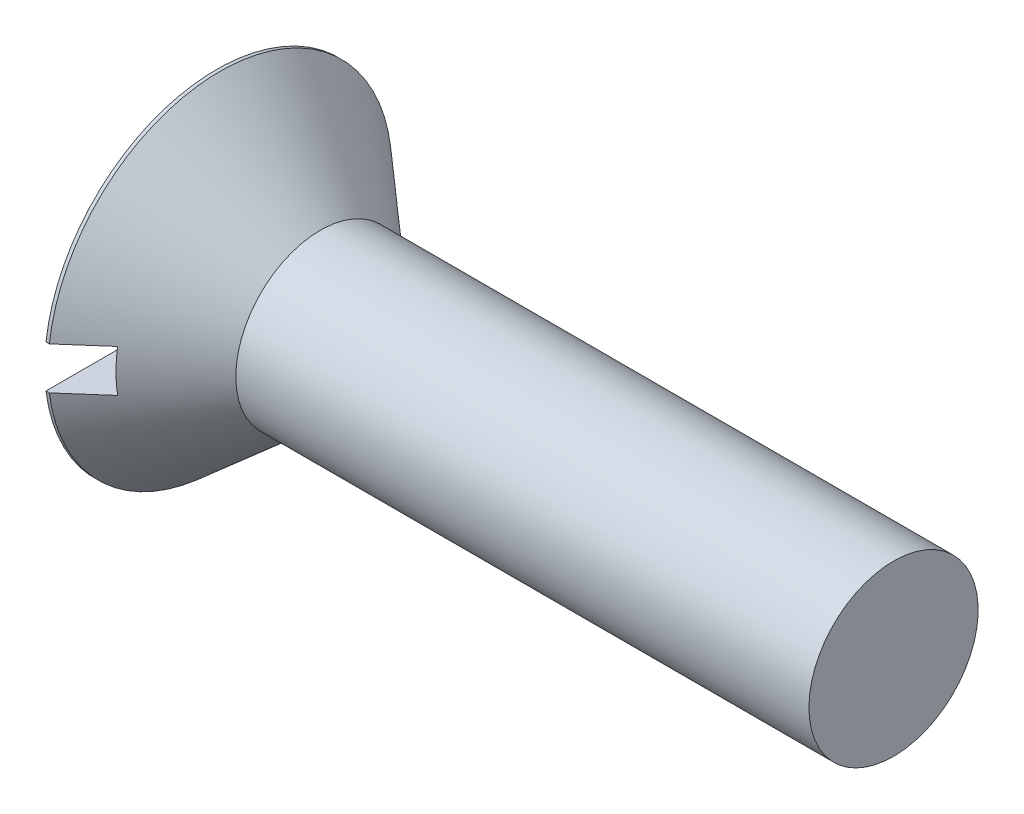
ISO-10303-21;
HEADER;
FILE_DESCRIPTION(('STEP AP214'),'2;1');
FILE_NAME('part.step','',(''),(''),'','','');
FILE_SCHEMA(('AUTOMOTIVE_DESIGN { 1 0 10303 214 1 1 1 1 }'));
ENDSEC;
DATA;
#1=APPLICATION_CONTEXT('core data for automotive mechanical design processes');
#2=APPLICATION_PROTOCOL_DEFINITION('international standard','automotive_design',2000,#1);
#3=PRODUCT_CONTEXT('',#1,'mechanical');
#4=PRODUCT('Part','Part','',(#3));
#5=PRODUCT_RELATED_PRODUCT_CATEGORY('part','',(#4));
#6=PRODUCT_DEFINITION_FORMATION('','',#4);
#7=PRODUCT_DEFINITION_CONTEXT('part definition',#1,'design');
#8=PRODUCT_DEFINITION('design','',#6,#7);
#9=PRODUCT_DEFINITION_SHAPE('','',#8);
#10=(LENGTH_UNIT() NAMED_UNIT(*) SI_UNIT(.MILLI.,.METRE.));
#11=(NAMED_UNIT(*) PLANE_ANGLE_UNIT() SI_UNIT($,.RADIAN.));
#12=(NAMED_UNIT(*) SI_UNIT($,.STERADIAN.) SOLID_ANGLE_UNIT());
#13=UNCERTAINTY_MEASURE_WITH_UNIT(LENGTH_MEASURE(1.E-05),#10,'distance_accuracy_value','');
#14=(GEOMETRIC_REPRESENTATION_CONTEXT(3) GLOBAL_UNCERTAINTY_ASSIGNED_CONTEXT((#13)) GLOBAL_UNIT_ASSIGNED_CONTEXT((#10,
#11,#12)) REPRESENTATION_CONTEXT('',''));
#15=CARTESIAN_POINT('',(0.,0.,0.));
#16=DIRECTION('',(0.,0.,1.));
#17=DIRECTION('',(1.,0.,0.));
#18=AXIS2_PLACEMENT_3D('',#15,#16,#17);
#19=CARTESIAN_POINT('',(2.2352,1.1938,-9.67739999999999));
#20=DIRECTION('',(-1.,0.,0.));
#21=DIRECTION('',(0.,0.,1.));
#22=AXIS2_PLACEMENT_3D('',#19,#20,#21);
#23=PLANE('',#22);
#24=DIRECTION('',(0.,-1.,0.));
#25=VECTOR('',#24,1.);
#26=CARTESIAN_POINT('',(2.2352,1.19379999999995,4.93366687898089));
#27=LINE('',#26,#25);
#28=CARTESIAN_POINT('',(2.2352,0.93915286624202,4.93366687898089));
#29=VERTEX_POINT('',#28);
#30=CARTESIAN_POINT('',(2.2352,-0.939152866242055,4.93366687898089));
#31=VERTEX_POINT('',#30);
#32=EDGE_CURVE('E316',#29,#31,#27,.T.);
#33=ORIENTED_EDGE('',*,*,#32,.T.);
#34=DIRECTION('',(0.,0.,-1.));
#35=VECTOR('',#34,1.);
#36=CARTESIAN_POINT('',(2.2352,-0.939152866242006,-9.6774));
#37=LINE('',#36,#35);
#38=CARTESIAN_POINT('',(2.2352,-0.939152866242041,0.939152866242038));
#39=VERTEX_POINT('',#38);
#40=EDGE_CURVE('E163',#31,#39,#37,.T.);
#41=ORIENTED_EDGE('',*,*,#40,.T.);
#42=DIRECTION('',(0.,-1.,0.));
#43=VECTOR('',#42,1.);
#44=CARTESIAN_POINT('',(2.2352,1.1938,0.939152866242037));
#45=LINE('',#44,#43);
#46=CARTESIAN_POINT('',(2.2352,-1.1938,0.939152866242037));
#47=VERTEX_POINT('',#46);
#48=EDGE_CURVE('E40',#39,#47,#45,.T.);
#49=ORIENTED_EDGE('',*,*,#48,.T.);
#50=DIRECTION('',(0.,0.,1.));
#51=VECTOR('',#50,1.);
#52=CARTESIAN_POINT('',(2.2352,-1.1938,-9.6774));
#53=LINE('',#52,#51);
#54=CARTESIAN_POINT('',(2.2352,-1.1938,7.80709754166015));
#55=VERTEX_POINT('',#54);
#56=EDGE_CURVE('E55',#47,#55,#53,.T.);
#57=ORIENTED_EDGE('',*,*,#56,.T.);
#58=CARTESIAN_POINT('',(2.2352,0.,0.));
#59=DIRECTION('',(-1.,0.,0.));
#60=DIRECTION('',(0.,0.,1.));
#61=AXIS2_PLACEMENT_3D('',#58,#59,#60);
#62=CIRCLE('',#61,7.89784340595558);
#63=CARTESIAN_POINT('',(2.2352,1.1938,7.80709754166015));
#64=VERTEX_POINT('',#63);
#65=EDGE_CURVE('E264',#64,#55,#62,.F.);
#66=ORIENTED_EDGE('',*,*,#65,.F.);
#67=DIRECTION('',(0.,0.,-1.));
#68=VECTOR('',#67,1.);
#69=CARTESIAN_POINT('',(2.2352,1.1938,9.6774));
#70=LINE('',#69,#68);
#71=CARTESIAN_POINT('',(2.2352,1.1938,0.939152866242037));
#72=VERTEX_POINT('',#71);
#73=EDGE_CURVE('E228',#64,#72,#70,.T.);
#74=ORIENTED_EDGE('',*,*,#73,.T.);
#75=CARTESIAN_POINT('',(2.2352,0.939152866242034,0.939152866242037));
#76=VERTEX_POINT('',#75);
#77=EDGE_CURVE('E11',#72,#76,#45,.T.);
#78=ORIENTED_EDGE('',*,*,#77,.T.);
#79=DIRECTION('',(0.,0.,1.));
#80=VECTOR('',#79,1.);
#81=CARTESIAN_POINT('',(2.2352,0.939152866242072,-9.67739999999999));
#82=LINE('',#81,#80);
#83=EDGE_CURVE('E317',#76,#29,#82,.T.);
#84=ORIENTED_EDGE('',*,*,#83,.T.);
#85=EDGE_LOOP('',(#33,#41,#49,#57,#66,#74,#78,#84));
#86=FACE_BOUND('',#85,.T.);
#87=ADVANCED_FACE('F32',(#86),#23,.T.);
#88=DIRECTION('',(0.,1.,0.));
#89=VECTOR('',#88,1.);
#90=CARTESIAN_POINT('',(2.2352,1.1938,-0.939152866242039));
#91=LINE('',#90,#89);
#92=CARTESIAN_POINT('',(2.2352,-1.1938,-0.939152866242039));
#93=VERTEX_POINT('',#92);
#94=CARTESIAN_POINT('',(2.2352,-0.939152866242035,-0.939152866242038));
#95=VERTEX_POINT('',#94);
#96=EDGE_CURVE('E389',#93,#95,#91,.T.);
#97=ORIENTED_EDGE('',*,*,#96,.T.);
#98=DIRECTION('',(0.,0.,-1.));
#99=VECTOR('',#98,1.);
#100=CARTESIAN_POINT('',(2.2352,-0.939152866242006,-9.6774));
#101=LINE('',#100,#99);
#102=CARTESIAN_POINT('',(2.2352,-0.939152866242022,-4.9336668789809));
#103=VERTEX_POINT('',#102);
#104=EDGE_CURVE('E189',#95,#103,#101,.T.);
#105=ORIENTED_EDGE('',*,*,#104,.T.);
#106=DIRECTION('',(0.,1.,0.));
#107=VECTOR('',#106,1.);
#108=CARTESIAN_POINT('',(2.2352,1.19379999999998,-4.93366687898089));
#109=LINE('',#108,#107);
#110=CARTESIAN_POINT('',(2.2352,0.939152866242055,-4.93366687898089));
#111=VERTEX_POINT('',#110);
#112=EDGE_CURVE('E332',#103,#111,#109,.T.);
#113=ORIENTED_EDGE('',*,*,#112,.T.);
#114=DIRECTION('',(0.,0.,1.));
#115=VECTOR('',#114,1.);
#116=CARTESIAN_POINT('',(2.2352,0.939152866242072,-9.67739999999999));
#117=LINE('',#116,#115);
#118=CARTESIAN_POINT('',(2.2352,0.939152866242041,-0.939152866242038));
#119=VERTEX_POINT('',#118);
#120=EDGE_CURVE('E322',#111,#119,#117,.T.);
#121=ORIENTED_EDGE('',*,*,#120,.T.);
#122=CARTESIAN_POINT('',(2.2352,1.1938,-0.939152866242035));
#123=VERTEX_POINT('',#122);
#124=EDGE_CURVE('E47',#119,#123,#91,.T.);
#125=ORIENTED_EDGE('',*,*,#124,.T.);
#126=CARTESIAN_POINT('',(2.2352,1.1938,-7.80709754166015));
#127=VERTEX_POINT('',#126);
#128=EDGE_CURVE('E231',#123,#127,#70,.T.);
#129=ORIENTED_EDGE('',*,*,#128,.T.);
#130=CARTESIAN_POINT('',(2.2352,-1.1938,-7.80709754166015));
#131=VERTEX_POINT('',#130);
#132=EDGE_CURVE('E268',#131,#127,#62,.F.);
#133=ORIENTED_EDGE('',*,*,#132,.F.);
#134=EDGE_CURVE('E232',#131,#93,#53,.T.);
#135=ORIENTED_EDGE('',*,*,#134,.T.);
#136=EDGE_LOOP('',(#97,#105,#113,#121,#125,#129,#133,#135));
#137=FACE_BOUND('',#136,.T.);
#138=ADVANCED_FACE('F311',(#137),#23,.T.);
#139=CARTESIAN_POINT('',(8.69008083333333,0.,0.497178541666667));
#140=DIRECTION('',(-0.0683113918583954,0.,-0.997664048536565));
#141=DIRECTION('',(-0.997664048536565,0.,0.0683113918583954));
#142=AXIS2_PLACEMENT_3D('',#139,#140,#141);
#143=PLANE('',#142);
#144=ORIENTED_EDGE('',*,*,#48,.F.);
#145=DIRECTION('',(0.995344390972083,0.0681525618022289,-0.0681525618022287));
#146=VECTOR('',#145,1.);
#147=CARTESIAN_POINT('',(8.72380707400527,-0.494869260856328,0.494869260856327));
#148=LINE('',#147,#146);
#149=CARTESIAN_POINT('',(7.9756,-0.546100000000002,0.546099999999999));
#150=VERTEX_POINT('',#149);
#151=EDGE_CURVE('E161',#39,#150,#148,.T.);
#152=ORIENTED_EDGE('',*,*,#151,.T.);
#153=DIRECTION('',(0.793328420082592,0.606365671400707,-0.0543202580629801));
#154=VECTOR('',#153,1.);
#155=CARTESIAN_POINT('',(0.,-6.6421,1.0922));
#156=LINE('',#155,#154);
#157=CARTESIAN_POINT('',(0.,-6.6421,1.0922));
#158=VERTEX_POINT('',#157);
#159=EDGE_CURVE('E186',#158,#150,#156,.T.);
#160=ORIENTED_EDGE('',*,*,#159,.F.);
#161=DIRECTION('',(0.,-1.,0.));
#162=VECTOR('',#161,1.);
#163=CARTESIAN_POINT('',(0.,6.6421,1.0922));
#164=LINE('',#163,#162);
#165=CARTESIAN_POINT('',(0.,-1.1938,1.0922));
#166=VERTEX_POINT('',#165);
#167=EDGE_CURVE('E344',#166,#158,#164,.T.);
#168=ORIENTED_EDGE('',*,*,#167,.F.);
#169=DIRECTION('',(0.997664048536565,0.,-0.0683113918583954));
#170=VECTOR('',#169,1.);
#171=CARTESIAN_POINT('',(2.95873739744039,-1.1938,0.889611292850418));
#172=LINE('',#171,#170);
#173=EDGE_CURVE('E223',#166,#47,#172,.T.);
#174=ORIENTED_EDGE('',*,*,#173,.T.);
#175=EDGE_LOOP('',(#144,#152,#160,#168,#174));
#176=FACE_BOUND('',#175,.T.);
#177=ADVANCED_FACE('F184',(#176),#143,.T.);
#178=DIRECTION('',(0.793328420082592,-0.606365671400707,-0.05432025806298));
#179=VECTOR('',#178,1.);
#180=CARTESIAN_POINT('',(0.,6.6421,1.0922));
#181=LINE('',#180,#179);
#182=CARTESIAN_POINT('',(0.,6.6421,1.0922));
#183=VERTEX_POINT('',#182);
#184=CARTESIAN_POINT('',(7.9756,0.546100000000001,0.5461));
#185=VERTEX_POINT('',#184);
#186=EDGE_CURVE('E209',#183,#185,#181,.T.);
#187=ORIENTED_EDGE('',*,*,#186,.T.);
#188=DIRECTION('',(-0.995344390972083,0.0681525618022283,0.0681525618022286));
#189=VECTOR('',#188,1.);
#190=CARTESIAN_POINT('',(8.72380707400527,0.494869260856325,0.494869260856327));
#191=LINE('',#190,#189);
#192=EDGE_CURVE('E328',#185,#76,#191,.T.);
#193=ORIENTED_EDGE('',*,*,#192,.T.);
#194=ORIENTED_EDGE('',*,*,#77,.F.);
#195=DIRECTION('',(-0.997664048536565,0.,0.0683113918583954));
#196=VECTOR('',#195,1.);
#197=CARTESIAN_POINT('',(1.63967255629894,1.1938,0.979929426877621));
#198=LINE('',#197,#196);
#199=CARTESIAN_POINT('',(0.,1.1938,1.0922));
#200=VERTEX_POINT('',#199);
#201=EDGE_CURVE('E225',#72,#200,#198,.T.);
#202=ORIENTED_EDGE('',*,*,#201,.T.);
#203=EDGE_CURVE('E345',#183,#200,#164,.T.);
#204=ORIENTED_EDGE('',*,*,#203,.F.);
#205=EDGE_LOOP('',(#187,#193,#194,#202,#204));
#206=FACE_BOUND('',#205,.T.);
#207=ADVANCED_FACE('F365',(#206),#143,.T.);
#208=CARTESIAN_POINT('',(8.69008083333333,0.,-0.497178541666667));
#209=DIRECTION('',(-0.0683113918583953,0.,0.997664048536565));
#210=DIRECTION('',(0.997664048536565,0.,0.0683113918583953));
#211=AXIS2_PLACEMENT_3D('',#208,#209,#210);
#212=PLANE('',#211);
#213=DIRECTION('',(0.793328420082592,0.606365671400707,0.0543202580629799));
#214=VECTOR('',#213,1.);
#215=CARTESIAN_POINT('',(0.,-6.6421,-1.0922));
#216=LINE('',#215,#214);
#217=CARTESIAN_POINT('',(0.,-6.6421,-1.0922));
#218=VERTEX_POINT('',#217);
#219=CARTESIAN_POINT('',(7.9756,-0.5461,-0.5461));
#220=VERTEX_POINT('',#219);
#221=EDGE_CURVE('E204',#218,#220,#216,.T.);
#222=ORIENTED_EDGE('',*,*,#221,.T.);
#223=DIRECTION('',(-0.995344390972083,-0.0681525618022284,-0.0681525618022285));
#224=VECTOR('',#223,1.);
#225=CARTESIAN_POINT('',(8.72380707400527,-0.494869260856325,-0.494869260856327));
#226=LINE('',#225,#224);
#227=EDGE_CURVE('E335',#220,#95,#226,.T.);
#228=ORIENTED_EDGE('',*,*,#227,.T.);
#229=ORIENTED_EDGE('',*,*,#96,.F.);
#230=DIRECTION('',(-0.997664048536565,0.,-0.0683113918583953));
#231=VECTOR('',#230,1.);
#232=CARTESIAN_POINT('',(1.63967255629895,-1.1938,-0.979929426877619));
#233=LINE('',#232,#231);
#234=CARTESIAN_POINT('',(0.,-1.1938,-1.0922));
#235=VERTEX_POINT('',#234);
#236=EDGE_CURVE('E219',#93,#235,#233,.T.);
#237=ORIENTED_EDGE('',*,*,#236,.T.);
#238=DIRECTION('',(0.,1.,0.));
#239=VECTOR('',#238,1.);
#240=CARTESIAN_POINT('',(0.,-6.6421,-1.0922));
#241=LINE('',#240,#239);
#242=EDGE_CURVE('E207',#218,#235,#241,.T.);
#243=ORIENTED_EDGE('',*,*,#242,.F.);
#244=EDGE_LOOP('',(#222,#228,#229,#237,#243));
#245=FACE_BOUND('',#244,.T.);
#246=ADVANCED_FACE('F388',(#245),#212,.T.);
#247=ORIENTED_EDGE('',*,*,#124,.F.);
#248=DIRECTION('',(0.995344390972083,-0.0681525618022288,0.0681525618022285));
#249=VECTOR('',#248,1.);
#250=CARTESIAN_POINT('',(8.72380707400527,0.494869260856329,-0.494869260856327));
#251=LINE('',#250,#249);
#252=CARTESIAN_POINT('',(7.9756,0.546100000000002,-0.546099999999998));
#253=VERTEX_POINT('',#252);
#254=EDGE_CURVE('E318',#119,#253,#251,.T.);
#255=ORIENTED_EDGE('',*,*,#254,.T.);
#256=DIRECTION('',(0.793328420082592,-0.606365671400707,0.0543202580629799));
#257=VECTOR('',#256,1.);
#258=CARTESIAN_POINT('',(0.,6.6421,-1.0922));
#259=LINE('',#258,#257);
#260=CARTESIAN_POINT('',(0.,6.6421,-1.0922));
#261=VERTEX_POINT('',#260);
#262=EDGE_CURVE('E198',#261,#253,#259,.T.);
#263=ORIENTED_EDGE('',*,*,#262,.F.);
#264=CARTESIAN_POINT('',(0.,1.1938,-1.0922));
#265=VERTEX_POINT('',#264);
#266=EDGE_CURVE('E203',#265,#261,#241,.T.);
#267=ORIENTED_EDGE('',*,*,#266,.F.);
#268=DIRECTION('',(0.997664048536565,0.,0.0683113918583953));
#269=VECTOR('',#268,1.);
#270=CARTESIAN_POINT('',(2.95873739744039,1.1938,-0.88961129285042));
#271=LINE('',#270,#269);
#272=EDGE_CURVE('E221',#265,#123,#271,.T.);
#273=ORIENTED_EDGE('',*,*,#272,.T.);
#274=EDGE_LOOP('',(#247,#255,#263,#267,#273));
#275=FACE_BOUND('',#274,.T.);
#276=ADVANCED_FACE('F375',(#275),#212,.T.);
#277=CARTESIAN_POINT('',(0.,0.,0.));
#278=DIRECTION('',(-1.,0.,0.));
#279=DIRECTION('',(0.,0.,1.));
#280=AXIS2_PLACEMENT_3D('',#277,#278,#279);
#281=PLANE('',#280);
#282=DIRECTION('',(0.,0.,1.));
#283=VECTOR('',#282,1.);
#284=CARTESIAN_POINT('',(0.,6.6421,-1.0922));
#285=LINE('',#284,#283);
#286=EDGE_CURVE('E341',#261,#183,#285,.T.);
#287=ORIENTED_EDGE('',*,*,#286,.T.);
#288=ORIENTED_EDGE('',*,*,#203,.T.);
#289=DIRECTION('',(0.,0.,-1.));
#290=VECTOR('',#289,1.);
#291=CARTESIAN_POINT('',(0.,1.1938,9.6774));
#292=LINE('',#291,#290);
#293=CARTESIAN_POINT('',(0.,1.1938,9.60348438432634));
#294=VERTEX_POINT('',#293);
#295=EDGE_CURVE('E236',#294,#200,#292,.T.);
#296=ORIENTED_EDGE('',*,*,#295,.F.);
#297=CARTESIAN_POINT('',(0.,0.,0.));
#298=DIRECTION('',(-1.,0.,0.));
#299=DIRECTION('',(0.,0.,1.));
#300=AXIS2_PLACEMENT_3D('',#297,#298,#299);
#301=CIRCLE('',#300,9.6774);
#302=CARTESIAN_POINT('',(0.,1.1938,-9.60348438432634));
#303=VERTEX_POINT('',#302);
#304=EDGE_CURVE('E263',#294,#303,#301,.T.);
#305=ORIENTED_EDGE('',*,*,#304,.T.);
#306=EDGE_CURVE('E227',#265,#303,#292,.T.);
#307=ORIENTED_EDGE('',*,*,#306,.F.);
#308=ORIENTED_EDGE('',*,*,#266,.T.);
#309=EDGE_LOOP('',(#287,#288,#296,#305,#307,#308));
#310=FACE_BOUND('',#309,.T.);
#311=ADVANCED_FACE('F34',(#310),#281,.T.);
#312=DIRECTION('',(0.,0.,1.));
#313=VECTOR('',#312,1.);
#314=CARTESIAN_POINT('',(0.,-1.1938,-9.6774));
#315=LINE('',#314,#313);
#316=CARTESIAN_POINT('',(0.,-1.1938,9.60348438432634));
#317=VERTEX_POINT('',#316);
#318=EDGE_CURVE('E239',#166,#317,#315,.T.);
#319=ORIENTED_EDGE('',*,*,#318,.F.);
#320=ORIENTED_EDGE('',*,*,#167,.T.);
#321=DIRECTION('',(0.,0.,-1.));
#322=VECTOR('',#321,1.);
#323=CARTESIAN_POINT('',(0.,-6.6421,1.0922));
#324=LINE('',#323,#322);
#325=EDGE_CURVE('E202',#158,#218,#324,.T.);
#326=ORIENTED_EDGE('',*,*,#325,.T.);
#327=ORIENTED_EDGE('',*,*,#242,.T.);
#328=CARTESIAN_POINT('',(0.,-1.1938,-9.60348438432634));
#329=VERTEX_POINT('',#328);
#330=EDGE_CURVE('E240',#329,#235,#315,.T.);
#331=ORIENTED_EDGE('',*,*,#330,.F.);
#332=EDGE_CURVE('E260',#329,#317,#301,.T.);
#333=ORIENTED_EDGE('',*,*,#332,.T.);
#334=EDGE_LOOP('',(#319,#320,#326,#327,#331,#333));
#335=FACE_BOUND('',#334,.T.);
#336=ADVANCED_FACE('F296',(#335),#281,.T.);
#337=CARTESIAN_POINT('',(2.2352,1.1938,9.6774));
#338=DIRECTION('',(0.,1.,0.));
#339=DIRECTION('',(0.,0.,1.));
#340=AXIS2_PLACEMENT_3D('',#337,#338,#339);
#341=PLANE('',#340);
#342=ORIENTED_EDGE('',*,*,#201,.F.);
#343=ORIENTED_EDGE('',*,*,#73,.F.);
#344=CARTESIAN_POINT('',(-11.4898026353366,1.1938,-19.7928369826092));
#345=CARTESIAN_POINT('',(-10.7282739013221,1.1938,-19.1296381719911));
#346=CARTESIAN_POINT('',(-9.96679664791202,1.1938,-18.4663802073044));
#347=CARTESIAN_POINT('',(-8.44400448853546,1.1938,-17.1396696071036));
#348=CARTESIAN_POINT('',(-7.68268958347168,1.1938,-16.4762169705534));
#349=CARTESIAN_POINT('',(-6.16009107003556,1.1938,-15.1488746382848));
#350=CARTESIAN_POINT('',(-5.39880752170639,1.1938,-14.4849848736861));
#351=CARTESIAN_POINT('',(-3.87658787542096,1.1938,-13.156815015664));
#352=CARTESIAN_POINT('',(-3.11565177568116,1.1938,-12.4925349242851));
#353=CARTESIAN_POINT('',(-1.61266837529184,1.1938,-11.1793728113545));
#354=CARTESIAN_POINT('',(-0.870608031036538,1.1938,-10.5305057197294));
#355=CARTESIAN_POINT('',(0.612654729346588,1.1938,-9.23176820965605));
#356=CARTESIAN_POINT('',(1.35385713234852,1.1938,-8.58189777620339));
#357=CARTESIAN_POINT('',(2.46431349757707,1.1938,-7.6057063127283));
#358=CARTESIAN_POINT('',(2.83420463694768,1.1938,-7.28011039465054));
#359=CARTESIAN_POINT('',(3.5733462958958,1.1938,-6.62818839376527));
#360=CARTESIAN_POINT('',(3.94259681230671,1.1938,-6.30186230736668));
#361=CARTESIAN_POINT('',(4.68009898382822,1.1938,-5.64810195873326));
#362=CARTESIAN_POINT('',(5.04835066622805,1.1938,-5.32066772733487));
#363=CARTESIAN_POINT('',(5.59944958950579,1.1938,-4.828088397102));
#364=CARTESIAN_POINT('',(5.78293538370408,1.1938,-4.66365796437121));
#365=CARTESIAN_POINT('',(6.14932062944482,1.1938,-4.33414540663899));
#366=CARTESIAN_POINT('',(6.33222008249685,1.1938,-4.16906328331783));
#367=CARTESIAN_POINT('',(6.61085838707249,1.1938,-3.91630624190142));
#368=CARTESIAN_POINT('',(6.7068950906178,1.1938,-3.82895981383194));
#369=CARTESIAN_POINT('',(6.89868546128946,1.1938,-3.65395652107032));
#370=CARTESIAN_POINT('',(6.99443912761007,1.1938,-3.56629965549599));
#371=CARTESIAN_POINT('',(7.28123634095181,1.1938,-3.30272759921683));
#372=CARTESIAN_POINT('',(7.47176893215877,1.1938,-3.12625362774134));
#373=CARTESIAN_POINT('',(7.75652836875402,1.1938,-2.85918720679188));
#374=CARTESIAN_POINT('',(7.85158225556605,1.1938,-2.76947695394893));
#375=CARTESIAN_POINT('',(8.04094270173715,1.1938,-2.58927165090814));
#376=CARTESIAN_POINT('',(8.13524926866174,1.1938,-2.49877660867459));
#377=CARTESIAN_POINT('',(8.32280199349844,1.1938,-2.31680042579566));
#378=CARTESIAN_POINT('',(8.41604873368795,1.1938,-2.22531988634259));
#379=CARTESIAN_POINT('',(8.6011346078612,1.1938,-2.04094854239069));
#380=CARTESIAN_POINT('',(8.6929738110529,1.1938,-1.94805780768049));
#381=CARTESIAN_POINT('',(8.87422797190535,1.1938,-1.76066399626998));
#382=CARTESIAN_POINT('',(8.96365125965577,1.1938,-1.66616899895782));
#383=CARTESIAN_POINT('',(9.13952454990479,1.1938,-1.47414431004954));
#384=CARTESIAN_POINT('',(9.22596985906224,1.1938,-1.37661025170417));
#385=CARTESIAN_POINT('',(9.35151816301608,1.1938,-1.22717825186044));
#386=CARTESIAN_POINT('',(9.39260236634853,1.1938,-1.17695004477579));
#387=CARTESIAN_POINT('',(9.47299969614775,1.1938,-1.07510106345905));
#388=CARTESIAN_POINT('',(9.5123131602323,1.1938,-1.02348055771595));
#389=CARTESIAN_POINT('',(9.58844644905848,1.1938,-0.918595747564626));
#390=CARTESIAN_POINT('',(9.62527166053205,1.1938,-0.865335382851739));
#391=CARTESIAN_POINT('',(9.69553557346323,1.1938,-0.756643066731603));
#392=CARTESIAN_POINT('',(9.72897683777324,1.1938,-0.701212803511129));
#393=CARTESIAN_POINT('',(9.78229490989066,1.1938,-0.603634652350031));
#394=CARTESIAN_POINT('',(9.80334267457935,1.1938,-0.562131586710286));
#395=CARTESIAN_POINT('',(9.84217202855095,1.1938,-0.47758953141221));
#396=CARTESIAN_POINT('',(9.85995294441654,1.1938,-0.434550227257595));
#397=CARTESIAN_POINT('',(9.89116809212026,1.1938,-0.347314527152102));
#398=CARTESIAN_POINT('',(9.90463847934805,1.1938,-0.303131307184443));
#399=CARTESIAN_POINT('',(9.92643385134319,1.1938,-0.213513453313853));
#400=CARTESIAN_POINT('',(9.93476333760671,1.1938,-0.16807995071195));
#401=CARTESIAN_POINT('',(9.94391422293017,1.1938,-0.0900477356647803));
#402=CARTESIAN_POINT('',(9.94622642713138,1.1938,-0.057620890433388));
#403=CARTESIAN_POINT('',(9.94780330336011,1.1938,0.00730866444990611));
#404=CARTESIAN_POINT('',(9.94706765854469,1.1938,0.039811381638135));
#405=CARTESIAN_POINT('',(9.94028733688771,1.1938,0.137101431386455));
#406=CARTESIAN_POINT('',(9.92966101559382,1.1938,0.20160008074918));
#407=CARTESIAN_POINT('',(9.89262661505728,1.1938,0.35049459972825));
#408=CARTESIAN_POINT('',(9.86193906369473,1.1938,0.433774450610289));
#409=CARTESIAN_POINT('',(9.80699388473532,1.1938,0.554532522865811));
#410=CARTESIAN_POINT('',(9.78712669328242,1.1938,0.594194052190609));
#411=CARTESIAN_POINT('',(9.74504611916625,1.1938,0.672252055325658));
#412=CARTESIAN_POINT('',(9.72283341846574,1.1938,0.710648892611942));
#413=CARTESIAN_POINT('',(9.65802013239421,1.1938,0.816731429600172));
#414=CARTESIAN_POINT('',(9.61337970085071,1.1938,0.883159086062938));
#415=CARTESIAN_POINT('',(9.52026331206001,1.1938,1.01329132600744));
#416=CARTESIAN_POINT('',(9.47178430864526,1.1938,1.07699368376862));
#417=CARTESIAN_POINT('',(9.37210823949184,1.1938,1.20247328026239));
#418=CARTESIAN_POINT('',(9.32090484748038,1.1938,1.2642454579166));
#419=CARTESIAN_POINT('',(9.21665334057523,1.1938,1.38621561131625));
#420=CARTESIAN_POINT('',(9.16360498874108,1.1938,1.44641338311511));
#421=CARTESIAN_POINT('',(9.0558712202194,1.1938,1.56591847516017));
#422=CARTESIAN_POINT('',(9.00117844412958,1.1938,1.62521913531284));
#423=CARTESIAN_POINT('',(8.89076932576251,1.1938,1.74286468104579));
#424=CARTESIAN_POINT('',(8.83505291155422,1.1938,1.80120949890987));
#425=CARTESIAN_POINT('',(8.72293087735949,1.1938,1.91703874022853));
#426=CARTESIAN_POINT('',(8.66652659646751,1.1938,1.97452446257211));
#427=CARTESIAN_POINT('',(8.55310321239535,1.1938,2.08888148786909));
#428=CARTESIAN_POINT('',(8.49608412845418,1.1938,2.14575280993806));
#429=CARTESIAN_POINT('',(8.32594080040157,1.1938,2.31399298383076));
#430=CARTESIAN_POINT('',(8.21210974043435,1.1938,2.4246466836363));
#431=CARTESIAN_POINT('',(7.98316902601451,1.1938,2.64462506391629));
#432=CARTESIAN_POINT('',(7.86805933025104,1.1938,2.75394970121025));
#433=CARTESIAN_POINT('',(7.63692082251556,1.1938,2.97164536682997));
#434=CARTESIAN_POINT('',(7.52089191915196,1.1938,3.08001629801449));
#435=CARTESIAN_POINT('',(7.2881654688085,1.1938,3.29603831860986));
#436=CARTESIAN_POINT('',(7.17146791737414,1.1938,3.40368940321475));
#437=CARTESIAN_POINT('',(6.8204206104814,1.1938,3.72601676561741));
#438=CARTESIAN_POINT('',(6.58532082273434,1.1938,3.93987573533653));
#439=CARTESIAN_POINT('',(6.11392315985063,1.1938,4.36623728025011));
#440=CARTESIAN_POINT('',(5.87762535629344,1.1938,4.57873993480768));
#441=CARTESIAN_POINT('',(5.40574548920108,1.1938,5.00148246261154));
#442=CARTESIAN_POINT('',(5.17016858782836,1.1938,5.21172810071984));
#443=CARTESIAN_POINT('',(4.69845742605191,1.1938,5.63159996322499));
#444=CARTESIAN_POINT('',(4.46232315719595,1.1938,5.8412261781186));
#445=CARTESIAN_POINT('',(3.75350149685631,1.1938,6.46928311178162));
#446=CARTESIAN_POINT('',(3.28022270774331,1.1938,6.88704616821166));
#447=CARTESIAN_POINT('',(2.21621828719052,1.1938,7.82423394194819));
#448=CARTESIAN_POINT('',(1.62524790719567,1.1938,8.34338046616924));
#449=CARTESIAN_POINT('',(0.442525830117864,1.1938,9.38078521090227));
#450=CARTESIAN_POINT('',(-0.149225868826985,1.1938,9.89904342929061));
#451=CARTESIAN_POINT('',(-1.33330631305607,1.1938,10.9350846526926));
#452=CARTESIAN_POINT('',(-1.92563513333196,1.1938,11.4528675719739));
#453=CARTESIAN_POINT('',(-3.11061605933093,1.1938,12.4880633822659));
#454=CARTESIAN_POINT('',(-3.70326816507868,1.1938,13.0054762732481));
#455=CARTESIAN_POINT('',(-5.49445193685419,1.1938,14.5685909035739));
#456=CARTESIAN_POINT('',(-6.69332378922161,1.1938,15.6139027891056));
#457=CARTESIAN_POINT('',(-8.49189186130723,1.1938,17.1813761403767));
#458=CARTESIAN_POINT('',(-9.09140946247876,1.1938,17.7037426397592));
#459=CARTESIAN_POINT('',(-10.2905401878066,1.1938,18.7483656046404));
#460=CARTESIAN_POINT('',(-10.8901533119325,1.1938,19.2706220701738));
#461=CARTESIAN_POINT('',(-11.4898026353366,1.1938,19.7928369826092));
#462=B_SPLINE_CURVE_WITH_KNOTS('',3,(#344,#345,#346,#347,#348,#349,#350,#351,#352,#353,#354,
#355,#356,#357,#358,#359,#360,#361,#362,#363,#364,#365,#366,#367,#368,#369,#370,#371,#372,#373,
#374,#375,#376,#377,#378,#379,#380,#381,#382,#383,#384,#385,#386,#387,#388,#389,#390,#391,#392,
#393,#394,#395,#396,#397,#398,#399,#400,#401,#402,#403,#404,#405,#406,#407,#408,#409,#410,#411,
#412,#413,#414,#415,#416,#417,#418,#419,#420,#421,#422,#423,#424,#425,#426,#427,#428,#429,#430,
#431,#432,#433,#434,#435,#436,#437,#438,#439,#440,#441,#442,#443,#444,#445,#446,#447,#448,#449,
#450,#451,#452,#453,#454,#455,#456,#457,#458,#459,#460,#461),.UNSPECIFIED.,.F.,.F.,(4,2,2,2,2,2,
2,2,2,2,2,2,2,2,2,2,2,2,2,2,2,2,2,2,2,2,2,2,2,2,2,2,2,2,2,2,2,2,2,2,2,2,2,2,2,2,2,2,2,2,2,2,2,2,
2,2,2,2,4),(0.,3.0294930783553,6.05900258307004,9.08930288302097,12.1195874489531,
15.0768051830438,18.0340675777782,19.512406974151,20.9907536572677,22.4690595351237,
23.2082064359523,23.9473514322697,24.3368016586253,24.7262529926026,25.5053464943481,
25.8974512032567,26.2895519376056,26.6814256802503,27.0732800924151,27.4635432269829,
27.8543956331783,28.0490394420361,28.2436459806837,28.4378167485541,28.6318393417547,
28.7713378867965,28.9108651554193,29.049189416706,29.1873923854761,29.2847831846665,
29.3821841084928,29.5771956093359,29.8418190426298,29.9748586210594,30.1078596238524,
30.3477358586735,30.5878043970473,30.8284570413328,31.0691407065908,31.3111390700322,
31.5531545042363,31.7947567435244,32.0363514441758,32.5125848503851,32.9888336880144,
33.4651304859523,33.9414304606563,34.894870958739,35.8482551463319,36.7955112649444,
37.7427818417582,39.6366290834052,41.9964650492509,44.3563066488178,46.7165126240292,
49.0767187793924,53.8484828133056,56.2339792041329,58.619474838325),.UNSPECIFIED.);
#463=CARTESIAN_POINT('',(0.188054315349483,1.1938,9.60348438432635));
#464=VERTEX_POINT('',#463);
#465=EDGE_CURVE('E275',#64,#464,#462,.T.);
#466=ORIENTED_EDGE('',*,*,#465,.T.);
#467=DIRECTION('',(-1.,0.,0.));
#468=VECTOR('',#467,1.);
#469=CARTESIAN_POINT('',(-6.34999999999999,1.1938,9.60348438432634));
#470=LINE('',#469,#468);
#471=EDGE_CURVE('E246',#464,#294,#470,.T.);
#472=ORIENTED_EDGE('',*,*,#471,.T.);
#473=ORIENTED_EDGE('',*,*,#295,.T.);
#474=EDGE_LOOP('',(#342,#343,#466,#472,#473));
#475=FACE_BOUND('',#474,.T.);
#476=ADVANCED_FACE('F292',(#475),#341,.F.);
#477=ORIENTED_EDGE('',*,*,#272,.F.);
#478=ORIENTED_EDGE('',*,*,#306,.T.);
#479=DIRECTION('',(-1.,0.,0.));
#480=VECTOR('',#479,1.);
#481=CARTESIAN_POINT('',(-6.34999999999999,1.1938,-9.60348438432634));
#482=LINE('',#481,#480);
#483=CARTESIAN_POINT('',(0.188054315349483,1.1938,-9.60348438432635));
#484=VERTEX_POINT('',#483);
#485=EDGE_CURVE('E248',#303,#484,#482,.F.);
#486=ORIENTED_EDGE('',*,*,#485,.T.);
#487=EDGE_CURVE('E392',#484,#127,#462,.T.);
#488=ORIENTED_EDGE('',*,*,#487,.T.);
#489=ORIENTED_EDGE('',*,*,#128,.F.);
#490=EDGE_LOOP('',(#477,#478,#486,#488,#489));
#491=FACE_BOUND('',#490,.T.);
#492=ADVANCED_FACE('F289',(#491),#341,.F.);
#493=CARTESIAN_POINT('',(2.2352,-1.1938,-9.6774));
#494=DIRECTION('',(0.,-1.,0.));
#495=DIRECTION('',(0.,0.,-1.));
#496=AXIS2_PLACEMENT_3D('',#493,#494,#495);
#497=PLANE('',#496);
#498=ORIENTED_EDGE('',*,*,#173,.F.);
#499=ORIENTED_EDGE('',*,*,#318,.T.);
#500=DIRECTION('',(-1.,0.,0.));
#501=VECTOR('',#500,1.);
#502=CARTESIAN_POINT('',(-6.34999999999999,-1.1938,9.60348438432634));
#503=LINE('',#502,#501);
#504=CARTESIAN_POINT('',(0.188054315349483,-1.1938,9.60348438432635));
#505=VERTEX_POINT('',#504);
#506=EDGE_CURVE('E244',#317,#505,#503,.F.);
#507=ORIENTED_EDGE('',*,*,#506,.T.);
#508=CARTESIAN_POINT('',(-11.4898026353366,-1.1938,19.7928369826092));
#509=CARTESIAN_POINT('',(-10.7282739013221,-1.1938,19.1296381719911));
#510=CARTESIAN_POINT('',(-9.96679664791202,-1.1938,18.4663802073045));
#511=CARTESIAN_POINT('',(-8.44400448853547,-1.1938,17.1396696071036));
#512=CARTESIAN_POINT('',(-7.68268958347169,-1.1938,16.4762169705534));
#513=CARTESIAN_POINT('',(-6.16009107003557,-1.1938,15.1488746382848));
#514=CARTESIAN_POINT('',(-5.39880752170641,-1.1938,14.4849848736861));
#515=CARTESIAN_POINT('',(-3.87658787542097,-1.1938,13.156815015664));
#516=CARTESIAN_POINT('',(-3.11565177568118,-1.1938,12.4925349242851));
#517=CARTESIAN_POINT('',(-1.61266837529185,-1.1938,11.1793728113545));
#518=CARTESIAN_POINT('',(-0.870608031036553,-1.1938,10.5305057197294));
#519=CARTESIAN_POINT('',(0.612654729346576,-1.1938,9.23176820965606));
#520=CARTESIAN_POINT('',(1.35385713234851,-1.1938,8.5818977762034));
#521=CARTESIAN_POINT('',(2.46431349757706,-1.1938,7.60570631272831));
#522=CARTESIAN_POINT('',(2.83420463694767,-1.1938,7.28011039465055));
#523=CARTESIAN_POINT('',(3.5733462958958,-1.1938,6.62818839376528));
#524=CARTESIAN_POINT('',(3.9425968123067,-1.1938,6.30186230736669));
#525=CARTESIAN_POINT('',(4.68009898382822,-1.1938,5.64810195873326));
#526=CARTESIAN_POINT('',(5.04835066622804,-1.1938,5.32066772733487));
#527=CARTESIAN_POINT('',(5.59944958950579,-1.1938,4.828088397102));
#528=CARTESIAN_POINT('',(5.78293538370408,-1.1938,4.66365796437121));
#529=CARTESIAN_POINT('',(6.14932062944482,-1.1938,4.33414540663899));
#530=CARTESIAN_POINT('',(6.33222008249685,-1.1938,4.16906328331784));
#531=CARTESIAN_POINT('',(6.61085838707249,-1.1938,3.91630624190142));
#532=CARTESIAN_POINT('',(6.7068950906178,-1.1938,3.82895981383194));
#533=CARTESIAN_POINT('',(6.89868546128946,-1.1938,3.65395652107033));
#534=CARTESIAN_POINT('',(6.99443912761006,-1.1938,3.56629965549599));
#535=CARTESIAN_POINT('',(7.28123634095181,-1.1938,3.30272759921684));
#536=CARTESIAN_POINT('',(7.47176893215877,-1.1938,3.12625362774134));
#537=CARTESIAN_POINT('',(7.75652836875402,-1.1938,2.85918720679188));
#538=CARTESIAN_POINT('',(7.85158225556605,-1.1938,2.76947695394893));
#539=CARTESIAN_POINT('',(8.04094270173715,-1.1938,2.58927165090814));
#540=CARTESIAN_POINT('',(8.13524926866174,-1.1938,2.49877660867459));
#541=CARTESIAN_POINT('',(8.32280199349844,-1.1938,2.31680042579566));
#542=CARTESIAN_POINT('',(8.41604873368795,-1.1938,2.22531988634259));
#543=CARTESIAN_POINT('',(8.6011346078612,-1.1938,2.04094854239069));
#544=CARTESIAN_POINT('',(8.6929738110529,-1.1938,1.94805780768049));
#545=CARTESIAN_POINT('',(8.87422797190534,-1.1938,1.76066399626998));
#546=CARTESIAN_POINT('',(8.96365125965577,-1.1938,1.66616899895783));
#547=CARTESIAN_POINT('',(9.13952454990478,-1.1938,1.47414431004954));
#548=CARTESIAN_POINT('',(9.22596985906224,-1.1938,1.37661025170417));
#549=CARTESIAN_POINT('',(9.35151816301608,-1.1938,1.22717825186044));
#550=CARTESIAN_POINT('',(9.39260236634853,-1.1938,1.17695004477579));
#551=CARTESIAN_POINT('',(9.47299969614775,-1.1938,1.07510106345905));
#552=CARTESIAN_POINT('',(9.5123131602323,-1.1938,1.02348055771595));
#553=CARTESIAN_POINT('',(9.58844644905848,-1.1938,0.918595747564625));
#554=CARTESIAN_POINT('',(9.62527166053205,-1.1938,0.865335382851739));
#555=CARTESIAN_POINT('',(9.69553557346323,-1.1938,0.756643066731603));
#556=CARTESIAN_POINT('',(9.72897683777324,-1.1938,0.701212803511128));
#557=CARTESIAN_POINT('',(9.78229490989066,-1.1938,0.603634652350028));
#558=CARTESIAN_POINT('',(9.80334267457935,-1.1938,0.562131586710281));
#559=CARTESIAN_POINT('',(9.84217202855096,-1.1938,0.477589531412205));
#560=CARTESIAN_POINT('',(9.85995294441654,-1.1938,0.434550227257591));
#561=CARTESIAN_POINT('',(9.89116809212026,-1.1938,0.347314527152098));
#562=CARTESIAN_POINT('',(9.90463847934805,-1.1938,0.303131307184439));
#563=CARTESIAN_POINT('',(9.92643385134319,-1.1938,0.21351345331385));
#564=CARTESIAN_POINT('',(9.93476333760671,-1.1938,0.168079950711948));
#565=CARTESIAN_POINT('',(9.94391422293017,-1.1938,0.0900477356647783));
#566=CARTESIAN_POINT('',(9.94622642713138,-1.1938,0.0576208904333856));
#567=CARTESIAN_POINT('',(9.94780330336011,-1.1938,-0.0073086644499082));
#568=CARTESIAN_POINT('',(9.94706765854469,-1.1938,-0.0398113816381363));
#569=CARTESIAN_POINT('',(9.94028733688771,-1.1938,-0.137101431386456));
#570=CARTESIAN_POINT('',(9.92966101559382,-1.1938,-0.201600080749182));
#571=CARTESIAN_POINT('',(9.89262661505728,-1.1938,-0.350494599728253));
#572=CARTESIAN_POINT('',(9.86193906369472,-1.1938,-0.433774450610293));
#573=CARTESIAN_POINT('',(9.80699388473531,-1.1938,-0.554532522865815));
#574=CARTESIAN_POINT('',(9.78712669328241,-1.1938,-0.594194052190612));
#575=CARTESIAN_POINT('',(9.74504611916624,-1.1938,-0.672252055325662));
#576=CARTESIAN_POINT('',(9.72283341846573,-1.1938,-0.710648892611947));
#577=CARTESIAN_POINT('',(9.65802013239421,-1.1938,-0.816731429600179));
#578=CARTESIAN_POINT('',(9.61337970085071,-1.1938,-0.883159086062946));
#579=CARTESIAN_POINT('',(9.52026331206,-1.1938,-1.01329132600745));
#580=CARTESIAN_POINT('',(9.47178430864525,-1.1938,-1.07699368376863));
#581=CARTESIAN_POINT('',(9.37210823949182,-1.1938,-1.2024732802624));
#582=CARTESIAN_POINT('',(9.32090484748037,-1.1938,-1.26424545791661));
#583=CARTESIAN_POINT('',(9.21665334057522,-1.1938,-1.38621561131626));
#584=CARTESIAN_POINT('',(9.16360498874107,-1.1938,-1.44641338311512));
#585=CARTESIAN_POINT('',(9.05587122021939,-1.1938,-1.56591847516019));
#586=CARTESIAN_POINT('',(9.00117844412956,-1.1938,-1.62521913531285));
#587=CARTESIAN_POINT('',(8.8907693257625,-1.1938,-1.7428646810458));
#588=CARTESIAN_POINT('',(8.83505291155421,-1.1938,-1.80120949890989));
#589=CARTESIAN_POINT('',(8.72293087735948,-1.1938,-1.91703874022855));
#590=CARTESIAN_POINT('',(8.6665265964675,-1.1938,-1.97452446257212));
#591=CARTESIAN_POINT('',(8.55310321239533,-1.1938,-2.08888148786911));
#592=CARTESIAN_POINT('',(8.49608412845417,-1.1938,-2.14575280993808));
#593=CARTESIAN_POINT('',(8.32594080040155,-1.1938,-2.31399298383077));
#594=CARTESIAN_POINT('',(8.21210974043433,-1.1938,-2.42464668363632));
#595=CARTESIAN_POINT('',(7.98316902601449,-1.1938,-2.64462506391631));
#596=CARTESIAN_POINT('',(7.86805933025102,-1.1938,-2.75394970121027));
#597=CARTESIAN_POINT('',(7.63692082251553,-1.1938,-2.97164536682999));
#598=CARTESIAN_POINT('',(7.52089191915194,-1.1938,-3.08001629801452));
#599=CARTESIAN_POINT('',(7.28816546880847,-1.1938,-3.29603831860989));
#600=CARTESIAN_POINT('',(7.17146791737411,-1.1938,-3.40368940321477));
#601=CARTESIAN_POINT('',(6.82042061048136,-1.1938,-3.72601676561745));
#602=CARTESIAN_POINT('',(6.5853208227343,-1.1938,-3.93987573533656));
#603=CARTESIAN_POINT('',(6.11392315985058,-1.1938,-4.36623728025015));
#604=CARTESIAN_POINT('',(5.87762535629339,-1.1938,-4.57873993480773));
#605=CARTESIAN_POINT('',(5.40574548920103,-1.1938,-5.00148246261159));
#606=CARTESIAN_POINT('',(5.17016858782831,-1.1938,-5.21172810071988));
#607=CARTESIAN_POINT('',(4.69845742605185,-1.1938,-5.63159996322504));
#608=CARTESIAN_POINT('',(4.46232315719589,-1.1938,-5.84122617811866));
#609=CARTESIAN_POINT('',(3.75350149685624,-1.1938,-6.46928311178168));
#610=CARTESIAN_POINT('',(3.28022270774324,-1.1938,-6.88704616821173));
#611=CARTESIAN_POINT('',(2.21621828719044,-1.1938,-7.82423394194826));
#612=CARTESIAN_POINT('',(1.62524790719559,-1.1938,-8.34338046616931));
#613=CARTESIAN_POINT('',(0.442525830117799,-1.1938,-9.38078521090233));
#614=CARTESIAN_POINT('',(-0.149225868827044,-1.1938,-9.89904342929067));
#615=CARTESIAN_POINT('',(-1.33330631305612,-1.1938,-10.9350846526926));
#616=CARTESIAN_POINT('',(-1.92563513333201,-1.1938,-11.452867571974));
#617=CARTESIAN_POINT('',(-3.11061605933097,-1.1938,-12.4880633822659));
#618=CARTESIAN_POINT('',(-3.70326816507871,-1.1938,-13.0054762732482));
#619=CARTESIAN_POINT('',(-5.49445193685421,-1.1938,-14.5685909035739));
#620=CARTESIAN_POINT('',(-6.69332378922163,-1.1938,-15.6139027891056));
#621=CARTESIAN_POINT('',(-8.49189186130724,-1.1938,-17.1813761403767));
#622=CARTESIAN_POINT('',(-9.09140946247877,-1.1938,-17.7037426397592));
#623=CARTESIAN_POINT('',(-10.2905401878066,-1.1938,-18.7483656046404));
#624=CARTESIAN_POINT('',(-10.8901533119325,-1.1938,-19.2706220701738));
#625=CARTESIAN_POINT('',(-11.4898026353366,-1.1938,-19.7928369826092));
#626=B_SPLINE_CURVE_WITH_KNOTS('',3,(#508,#509,#510,#511,#512,#513,#514,#515,#516,#517,#518,
#519,#520,#521,#522,#523,#524,#525,#526,#527,#528,#529,#530,#531,#532,#533,#534,#535,#536,#537,
#538,#539,#540,#541,#542,#543,#544,#545,#546,#547,#548,#549,#550,#551,#552,#553,#554,#555,#556,
#557,#558,#559,#560,#561,#562,#563,#564,#565,#566,#567,#568,#569,#570,#571,#572,#573,#574,#575,
#576,#577,#578,#579,#580,#581,#582,#583,#584,#585,#586,#587,#588,#589,#590,#591,#592,#593,#594,
#595,#596,#597,#598,#599,#600,#601,#602,#603,#604,#605,#606,#607,#608,#609,#610,#611,#612,#613,
#614,#615,#616,#617,#618,#619,#620,#621,#622,#623,#624,#625),.UNSPECIFIED.,.F.,.F.,(4,2,2,2,2,2,
2,2,2,2,2,2,2,2,2,2,2,2,2,2,2,2,2,2,2,2,2,2,2,2,2,2,2,2,2,2,2,2,2,2,2,2,2,2,2,2,2,2,2,2,2,2,2,2,
2,2,2,2,4),(0.,3.02949307835529,6.05900258307003,9.08930288302095,12.1195874489531,
15.0768051830438,18.0340675777782,19.512406974151,20.9907536572677,22.4690595351237,
23.2082064359523,23.9473514322697,24.3368016586253,24.7262529926026,25.5053464943481,
25.8974512032567,26.2895519376056,26.6814256802503,27.0732800924152,27.4635432269829,
27.8543956331783,28.0490394420361,28.2436459806837,28.4378167485541,28.6318393417547,
28.7713378867965,28.9108651554193,29.049189416706,29.1873923854761,29.2847831846665,
29.3821841084928,29.5771956093359,29.8418190426298,29.9748586210594,30.1078596238524,
30.3477358586735,30.5878043970473,30.8284570413328,31.0691407065908,31.3111390700322,
31.5531545042363,31.7947567435244,32.0363514441758,32.5125848503851,32.9888336880144,
33.4651304859523,33.9414304606563,34.8948709587391,35.848255146332,36.7955112649445,
37.7427818417583,39.6366290834053,41.996465049251,44.3563066488179,46.7165126240293,
49.0767187793924,53.8484828133056,56.2339792041329,58.619474838325),.UNSPECIFIED.);
#627=EDGE_CURVE('E267',#505,#55,#626,.T.);
#628=ORIENTED_EDGE('',*,*,#627,.T.);
#629=ORIENTED_EDGE('',*,*,#56,.F.);
#630=EDGE_LOOP('',(#498,#499,#507,#628,#629));
#631=FACE_BOUND('',#630,.T.);
#632=ADVANCED_FACE('F284',(#631),#497,.F.);
#633=ORIENTED_EDGE('',*,*,#236,.F.);
#634=ORIENTED_EDGE('',*,*,#134,.F.);
#635=CARTESIAN_POINT('',(0.188054315349483,-1.1938,-9.60348438432635));
#636=VERTEX_POINT('',#635);
#637=EDGE_CURVE('E276',#131,#636,#626,.T.);
#638=ORIENTED_EDGE('',*,*,#637,.T.);
#639=DIRECTION('',(-1.,0.,0.));
#640=VECTOR('',#639,1.);
#641=CARTESIAN_POINT('',(-6.34999999999999,-1.1938,-9.60348438432634));
#642=LINE('',#641,#640);
#643=EDGE_CURVE('E235',#636,#329,#642,.T.);
#644=ORIENTED_EDGE('',*,*,#643,.T.);
#645=ORIENTED_EDGE('',*,*,#330,.T.);
#646=EDGE_LOOP('',(#633,#634,#638,#644,#645));
#647=FACE_BOUND('',#646,.T.);
#648=ADVANCED_FACE('F288',(#647),#497,.F.);
#649=CARTESIAN_POINT('',(-6.34999999999999,0.,0.));
#650=DIRECTION('',(-1.,0.,0.));
#651=DIRECTION('',(0.,0.,1.));
#652=AXIS2_PLACEMENT_3D('',#649,#650,#651);
#653=CYLINDRICAL_SURFACE('',#652,9.6774);
#654=ORIENTED_EDGE('',*,*,#485,.F.);
#655=ORIENTED_EDGE('',*,*,#304,.F.);
#656=ORIENTED_EDGE('',*,*,#471,.F.);
#657=CARTESIAN_POINT('',(0.188054315349483,0.,0.));
#658=DIRECTION('',(-1.,0.,0.));
#659=DIRECTION('',(0.,0.,1.));
#660=AXIS2_PLACEMENT_3D('',#657,#658,#659);
#661=CIRCLE('',#660,9.6774);
#662=EDGE_CURVE('E259',#464,#484,#661,.T.);
#663=ORIENTED_EDGE('',*,*,#662,.T.);
#664=EDGE_LOOP('',(#654,#655,#656,#663));
#665=FACE_BOUND('',#664,.T.);
#666=ADVANCED_FACE('F404',(#665),#653,.T.);
#667=ORIENTED_EDGE('',*,*,#506,.F.);
#668=ORIENTED_EDGE('',*,*,#332,.F.);
#669=ORIENTED_EDGE('',*,*,#643,.F.);
#670=EDGE_CURVE('E256',#636,#505,#661,.T.);
#671=ORIENTED_EDGE('',*,*,#670,.T.);
#672=EDGE_LOOP('',(#667,#668,#669,#671));
#673=FACE_BOUND('',#672,.T.);
#674=ADVANCED_FACE('F307',(#673),#653,.T.);
#675=CARTESIAN_POINT('',(0.188054315349483,0.,0.));
#676=DIRECTION('',(-1.,0.,0.));
#677=DIRECTION('',(0.,0.,1.));
#678=AXIS2_PLACEMENT_3D('',#675,#676,#677);
#679=CONICAL_SURFACE('',#678,9.6774,0.715584993317677);
#680=ORIENTED_EDGE('',*,*,#487,.F.);
#681=ORIENTED_EDGE('',*,*,#662,.F.);
#682=ORIENTED_EDGE('',*,*,#465,.F.);
#683=ORIENTED_EDGE('',*,*,#65,.T.);
#684=ORIENTED_EDGE('',*,*,#627,.F.);
#685=ORIENTED_EDGE('',*,*,#670,.F.);
#686=ORIENTED_EDGE('',*,*,#637,.F.);
#687=ORIENTED_EDGE('',*,*,#132,.T.);
#688=EDGE_LOOP('',(#680,#681,#682,#683,#684,#685,#686,#687));
#689=FACE_BOUND('',#688,.T.);
#690=CARTESIAN_POINT('',(5.842,0.,0.));
#691=DIRECTION('',(-1.,0.,0.));
#692=DIRECTION('',(0.,0.,1.));
#693=AXIS2_PLACEMENT_3D('',#690,#691,#692);
#694=CIRCLE('',#693,4.7625);
#695=CARTESIAN_POINT('',(5.842,0.,4.7625));
#696=VERTEX_POINT('',#695);
#697=EDGE_CURVE('E253',#696,#696,#694,.T.);
#698=ORIENTED_EDGE('',*,*,#697,.T.);
#699=EDGE_LOOP('',(#698));
#700=FACE_BOUND('',#699,.T.);
#701=ADVANCED_FACE('F281',(#689,#700),#679,.T.);
#702=CARTESIAN_POINT('',(-6.34999999999999,0.,0.));
#703=DIRECTION('',(-1.,0.,0.));
#704=DIRECTION('',(0.,0.,1.));
#705=AXIS2_PLACEMENT_3D('',#702,#703,#704);
#706=CYLINDRICAL_SURFACE('',#705,4.7625);
#707=CARTESIAN_POINT('',(38.1,0.,0.));
#708=DIRECTION('',(-1.,0.,0.));
#709=DIRECTION('',(0.,0.,1.));
#710=AXIS2_PLACEMENT_3D('',#707,#708,#709);
#711=CIRCLE('',#710,4.7625);
#712=CARTESIAN_POINT('',(38.1,0.,4.7625));
#713=VERTEX_POINT('',#712);
#714=EDGE_CURVE('E250',#713,#713,#711,.T.);
#715=ORIENTED_EDGE('',*,*,#714,.T.);
#716=EDGE_LOOP('',(#715));
#717=FACE_BOUND('',#716,.T.);
#718=ORIENTED_EDGE('',*,*,#697,.F.);
#719=EDGE_LOOP('',(#718));
#720=FACE_BOUND('',#719,.T.);
#721=ADVANCED_FACE('F300',(#717,#720),#706,.T.);
#722=CARTESIAN_POINT('',(38.1,4.7625,0.));
#723=DIRECTION('',(1.,0.,0.));
#724=DIRECTION('',(0.,0.,-1.));
#725=AXIS2_PLACEMENT_3D('',#722,#723,#724);
#726=PLANE('',#725);
#727=ORIENTED_EDGE('',*,*,#714,.F.);
#728=EDGE_LOOP('',(#727));
#729=FACE_BOUND('',#728,.T.);
#730=ADVANCED_FACE('F298',(#729),#726,.T.);
#731=CARTESIAN_POINT('',(7.9756,0.5461,-0.5461));
#732=DIRECTION('',(1.,0.,0.));
#733=DIRECTION('',(0.,0.,-1.));
#734=AXIS2_PLACEMENT_3D('',#731,#732,#733);
#735=PLANE('',#734);
#736=DIRECTION('',(0.,1.,0.));
#737=VECTOR('',#736,1.);
#738=CARTESIAN_POINT('',(7.9756,-0.5461,-0.5461));
#739=LINE('',#738,#737);
#740=EDGE_CURVE('E195',#220,#253,#739,.T.);
#741=ORIENTED_EDGE('',*,*,#740,.F.);
#742=DIRECTION('',(0.,0.,-1.));
#743=VECTOR('',#742,1.);
#744=CARTESIAN_POINT('',(7.9756,-0.5461,0.5461));
#745=LINE('',#744,#743);
#746=EDGE_CURVE('E178',#150,#220,#745,.T.);
#747=ORIENTED_EDGE('',*,*,#746,.F.);
#748=DIRECTION('',(0.,-1.,0.));
#749=VECTOR('',#748,1.);
#750=CARTESIAN_POINT('',(7.9756,0.5461,0.5461));
#751=LINE('',#750,#749);
#752=EDGE_CURVE('E170',#185,#150,#751,.T.);
#753=ORIENTED_EDGE('',*,*,#752,.F.);
#754=DIRECTION('',(0.,0.,1.));
#755=VECTOR('',#754,1.);
#756=CARTESIAN_POINT('',(7.9756,0.5461,-0.5461));
#757=LINE('',#756,#755);
#758=EDGE_CURVE('E179',#253,#185,#757,.T.);
#759=ORIENTED_EDGE('',*,*,#758,.F.);
#760=EDGE_LOOP('',(#741,#747,#753,#759));
#761=FACE_BOUND('',#760,.T.);
#762=ADVANCED_FACE('F193',(#761),#735,.F.);
#763=CARTESIAN_POINT('',(7.9756,-0.5461,-0.5461));
#764=DIRECTION('',(-0.607262254737891,0.794501449948741,0.));
#765=DIRECTION('',(-0.794501449948741,-0.607262254737891,0.));
#766=AXIS2_PLACEMENT_3D('',#763,#764,#765);
#767=PLANE('',#766);
#768=ORIENTED_EDGE('',*,*,#221,.F.);
#769=ORIENTED_EDGE('',*,*,#325,.F.);
#770=ORIENTED_EDGE('',*,*,#159,.T.);
#771=ORIENTED_EDGE('',*,*,#746,.T.);
#772=EDGE_LOOP('',(#768,#769,#770,#771));
#773=FACE_BOUND('',#772,.T.);
#774=ADVANCED_FACE('F200',(#773),#767,.T.);
#775=CARTESIAN_POINT('',(7.9756,0.5461,0.5461));
#776=DIRECTION('',(-0.607262254737891,-0.794501449948741,0.));
#777=DIRECTION('',(0.794501449948741,-0.607262254737891,0.));
#778=AXIS2_PLACEMENT_3D('',#775,#776,#777);
#779=PLANE('',#778);
#780=ORIENTED_EDGE('',*,*,#186,.F.);
#781=ORIENTED_EDGE('',*,*,#286,.F.);
#782=ORIENTED_EDGE('',*,*,#262,.T.);
#783=ORIENTED_EDGE('',*,*,#758,.T.);
#784=EDGE_LOOP('',(#780,#781,#782,#783));
#785=FACE_BOUND('',#784,.T.);
#786=ADVANCED_FACE('F373',(#785),#779,.T.);
#787=CARTESIAN_POINT('',(7.9756,-0.546100000000002,0.546099999999998));
#788=DIRECTION('',(-0.607262254737891,0.,-0.794501449948741));
#789=DIRECTION('',(0.794501449948741,0.,-0.607262254737891));
#790=AXIS2_PLACEMENT_3D('',#787,#788,#789);
#791=PLANE('',#790);
#792=DIRECTION('',(0.793328420082592,-0.0543202580629778,-0.606365671400707));
#793=VECTOR('',#792,1.);
#794=CARTESIAN_POINT('',(0.,1.09219999999998,6.6421));
#795=LINE('',#794,#793);
#796=EDGE_CURVE('E167',#29,#185,#795,.T.);
#797=ORIENTED_EDGE('',*,*,#796,.T.);
#798=ORIENTED_EDGE('',*,*,#752,.T.);
#799=DIRECTION('',(0.793328420082592,0.0543202580629821,-0.606365671400707));
#800=VECTOR('',#799,1.);
#801=CARTESIAN_POINT('',(0.,-1.09220000000002,6.6421));
#802=LINE('',#801,#800);
#803=EDGE_CURVE('E157',#31,#150,#802,.T.);
#804=ORIENTED_EDGE('',*,*,#803,.F.);
#805=ORIENTED_EDGE('',*,*,#32,.F.);
#806=EDGE_LOOP('',(#797,#798,#804,#805));
#807=FACE_BOUND('',#806,.T.);
#808=ADVANCED_FACE('F171',(#807),#791,.T.);
#809=CARTESIAN_POINT('',(8.69008083333333,0.497178541666667,0.));
#810=DIRECTION('',(-0.0683113918583953,-0.997664048536565,0.));
#811=DIRECTION('',(0.997664048536565,-0.0683113918583953,0.));
#812=AXIS2_PLACEMENT_3D('',#809,#810,#811);
#813=PLANE('',#812);
#814=ORIENTED_EDGE('',*,*,#192,.F.);
#815=ORIENTED_EDGE('',*,*,#796,.F.);
#816=ORIENTED_EDGE('',*,*,#83,.F.);
#817=EDGE_LOOP('',(#814,#815,#816));
#818=FACE_BOUND('',#817,.T.);
#819=ADVANCED_FACE('F502',(#818),#813,.T.);
#820=CARTESIAN_POINT('',(8.69008083333333,-0.497178541666667,0.));
#821=DIRECTION('',(-0.0683113918583954,0.997664048536565,0.));
#822=DIRECTION('',(-0.997664048536565,-0.0683113918583954,0.));
#823=AXIS2_PLACEMENT_3D('',#820,#821,#822);
#824=PLANE('',#823);
#825=ORIENTED_EDGE('',*,*,#803,.T.);
#826=ORIENTED_EDGE('',*,*,#151,.F.);
#827=ORIENTED_EDGE('',*,*,#40,.F.);
#828=EDGE_LOOP('',(#825,#826,#827));
#829=FACE_BOUND('',#828,.T.);
#830=ADVANCED_FACE('F159',(#829),#824,.T.);
#831=CARTESIAN_POINT('',(7.9756,0.546100000000002,-0.546099999999998));
#832=DIRECTION('',(-0.607262254737891,0.,0.794501449948741));
#833=DIRECTION('',(-0.794501449948741,0.,-0.607262254737891));
#834=AXIS2_PLACEMENT_3D('',#831,#832,#833);
#835=PLANE('',#834);
#836=DIRECTION('',(0.793328420082592,0.054320258062978,0.606365671400707));
#837=VECTOR('',#836,1.);
#838=CARTESIAN_POINT('',(0.,-1.09219999999998,-6.6421));
#839=LINE('',#838,#837);
#840=EDGE_CURVE('E319',#103,#220,#839,.T.);
#841=ORIENTED_EDGE('',*,*,#840,.T.);
#842=ORIENTED_EDGE('',*,*,#740,.T.);
#843=DIRECTION('',(0.793328420082592,-0.0543202580629821,0.606365671400707));
#844=VECTOR('',#843,1.);
#845=CARTESIAN_POINT('',(0.,1.09220000000002,-6.6421));
#846=LINE('',#845,#844);
#847=EDGE_CURVE('E166',#111,#253,#846,.T.);
#848=ORIENTED_EDGE('',*,*,#847,.F.);
#849=ORIENTED_EDGE('',*,*,#112,.F.);
#850=EDGE_LOOP('',(#841,#842,#848,#849));
#851=FACE_BOUND('',#850,.T.);
#852=ADVANCED_FACE('F383',(#851),#835,.T.);
#853=ORIENTED_EDGE('',*,*,#227,.F.);
#854=ORIENTED_EDGE('',*,*,#840,.F.);
#855=ORIENTED_EDGE('',*,*,#104,.F.);
#856=EDGE_LOOP('',(#853,#854,#855));
#857=FACE_BOUND('',#856,.T.);
#858=ADVANCED_FACE('F386',(#857),#824,.T.);
#859=ORIENTED_EDGE('',*,*,#847,.T.);
#860=ORIENTED_EDGE('',*,*,#254,.F.);
#861=ORIENTED_EDGE('',*,*,#120,.F.);
#862=EDGE_LOOP('',(#859,#860,#861));
#863=FACE_BOUND('',#862,.T.);
#864=ADVANCED_FACE('F378',(#863),#813,.T.);
#865=CLOSED_SHELL('',(#87,#138,#177,#207,#246,#276,#311,#336,#476,#492,#632,#648,#666,#674,#701,
#721,#730,#762,#774,#786,#808,#819,#830,#852,#858,#864));
#866=MANIFOLD_SOLID_BREP('B2',#865);
#867=ADVANCED_BREP_SHAPE_REPRESENTATION('',(#18,#866),#14);
#868=SHAPE_DEFINITION_REPRESENTATION(#9,#867);
ENDSEC;
END-ISO-10303-21;
